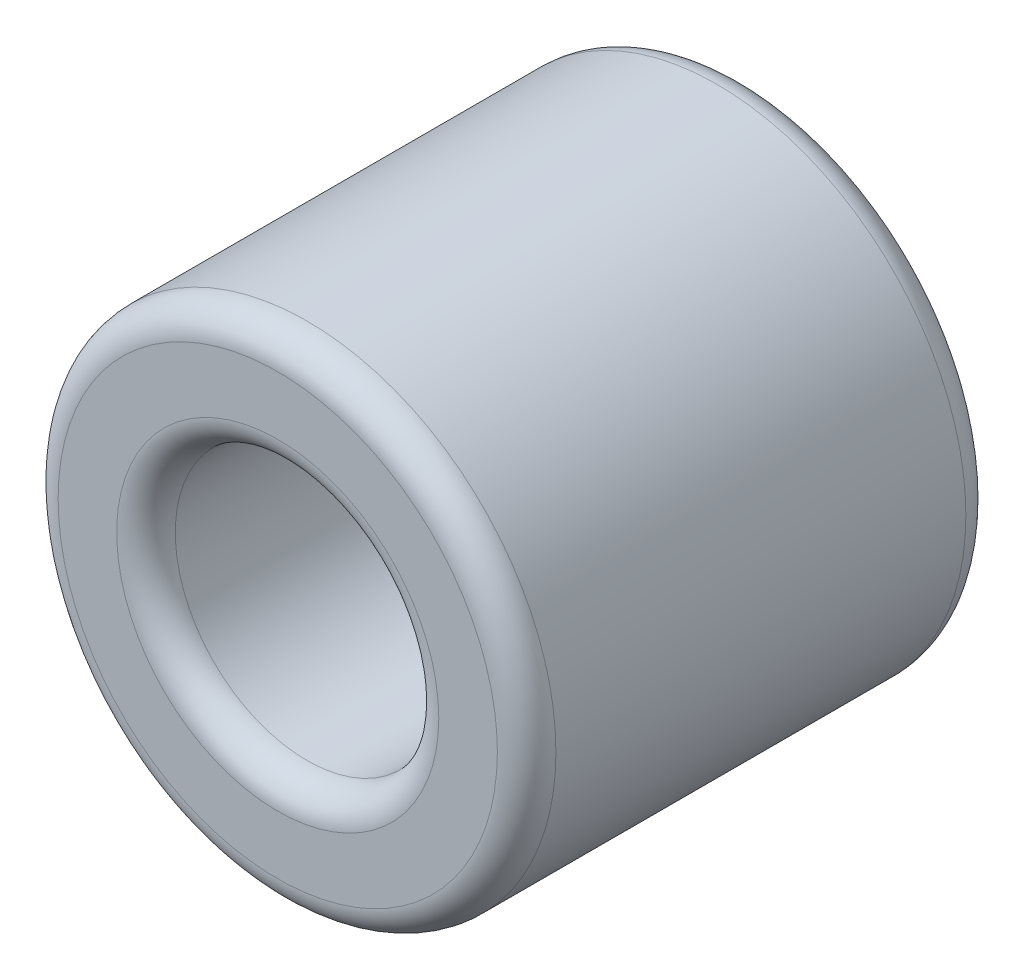
ISO-10303-21;
HEADER;
FILE_DESCRIPTION(('STEP AP214'),'2;1');
FILE_NAME('part.step','',(''),(''),'','','');
FILE_SCHEMA(('AUTOMOTIVE_DESIGN { 1 0 10303 214 1 1 1 1 }'));
ENDSEC;
DATA;
#1=APPLICATION_CONTEXT('core data for automotive mechanical design processes');
#2=APPLICATION_PROTOCOL_DEFINITION('international standard','automotive_design',2000,#1);
#3=PRODUCT_CONTEXT('',#1,'mechanical');
#4=PRODUCT('Part','Part','',(#3));
#5=PRODUCT_RELATED_PRODUCT_CATEGORY('part','',(#4));
#6=PRODUCT_DEFINITION_FORMATION('','',#4);
#7=PRODUCT_DEFINITION_CONTEXT('part definition',#1,'design');
#8=PRODUCT_DEFINITION('design','',#6,#7);
#9=PRODUCT_DEFINITION_SHAPE('','',#8);
#10=(LENGTH_UNIT() NAMED_UNIT(*) SI_UNIT(.MILLI.,.METRE.));
#11=(NAMED_UNIT(*) PLANE_ANGLE_UNIT() SI_UNIT($,.RADIAN.));
#12=(NAMED_UNIT(*) SI_UNIT($,.STERADIAN.) SOLID_ANGLE_UNIT());
#13=UNCERTAINTY_MEASURE_WITH_UNIT(LENGTH_MEASURE(1.E-05),#10,'distance_accuracy_value','');
#14=(GEOMETRIC_REPRESENTATION_CONTEXT(3) GLOBAL_UNCERTAINTY_ASSIGNED_CONTEXT((#13)) GLOBAL_UNIT_ASSIGNED_CONTEXT((#10,
#11,#12)) REPRESENTATION_CONTEXT('',''));
#15=CARTESIAN_POINT('',(0.,0.,0.));
#16=DIRECTION('',(0.,0.,1.));
#17=DIRECTION('',(1.,0.,0.));
#18=AXIS2_PLACEMENT_3D('',#15,#16,#17);
#19=CARTESIAN_POINT('',(0.,0.,8.));
#20=DIRECTION('',(0.,0.,1.));
#21=DIRECTION('',(1.,0.,0.));
#22=AXIS2_PLACEMENT_3D('',#19,#20,#21);
#23=PLANE('',#22);
#24=CARTESIAN_POINT('',(0.,0.,8.));
#25=DIRECTION('',(0.,0.,1.));
#26=DIRECTION('',(1.,0.,0.));
#27=AXIS2_PLACEMENT_3D('',#24,#25,#26);
#28=CIRCLE('',#27,2.75);
#29=CARTESIAN_POINT('',(2.75,0.,8.));
#30=VERTEX_POINT('',#29);
#31=EDGE_CURVE('E10',#30,#30,#28,.F.);
#32=ORIENTED_EDGE('',*,*,#31,.T.);
#33=EDGE_LOOP('',(#32));
#34=FACE_BOUND('',#33,.T.);
#35=CARTESIAN_POINT('',(0.,0.,8.));
#36=DIRECTION('',(0.,0.,1.));
#37=DIRECTION('',(1.,0.,0.));
#38=AXIS2_PLACEMENT_3D('',#35,#36,#37);
#39=CIRCLE('',#38,3.75);
#40=CARTESIAN_POINT('',(3.75,0.,8.));
#41=VERTEX_POINT('',#40);
#42=EDGE_CURVE('E42',#41,#41,#39,.T.);
#43=ORIENTED_EDGE('',*,*,#42,.T.);
#44=EDGE_LOOP('',(#43));
#45=FACE_BOUND('',#44,.T.);
#46=ADVANCED_FACE('F40',(#34,#45),#23,.T.);
#47=CARTESIAN_POINT('',(0.,0.,0.));
#48=DIRECTION('',(0.,0.,1.));
#49=DIRECTION('',(1.,0.,0.));
#50=AXIS2_PLACEMENT_3D('',#47,#48,#49);
#51=PLANE('',#50);
#52=CARTESIAN_POINT('',(0.,0.,0.));
#53=DIRECTION('',(0.,0.,1.));
#54=DIRECTION('',(1.,0.,0.));
#55=AXIS2_PLACEMENT_3D('',#52,#53,#54);
#56=CIRCLE('',#55,2.75);
#57=CARTESIAN_POINT('',(2.75,0.,0.));
#58=VERTEX_POINT('',#57);
#59=EDGE_CURVE('E64',#58,#58,#56,.T.);
#60=ORIENTED_EDGE('',*,*,#59,.T.);
#61=EDGE_LOOP('',(#60));
#62=FACE_BOUND('',#61,.T.);
#63=CARTESIAN_POINT('',(0.,0.,0.));
#64=DIRECTION('',(0.,0.,1.));
#65=DIRECTION('',(1.,0.,0.));
#66=AXIS2_PLACEMENT_3D('',#63,#64,#65);
#67=CIRCLE('',#66,3.75);
#68=CARTESIAN_POINT('',(3.75,0.,0.));
#69=VERTEX_POINT('',#68);
#70=EDGE_CURVE('E67',#69,#69,#67,.F.);
#71=ORIENTED_EDGE('',*,*,#70,.T.);
#72=EDGE_LOOP('',(#71));
#73=FACE_BOUND('',#72,.T.);
#74=ADVANCED_FACE('F68',(#62,#73),#51,.F.);
#75=CARTESIAN_POINT('',(0.,0.,8.));
#76=DIRECTION('',(0.,0.,-1.));
#77=DIRECTION('',(-1.,0.,0.));
#78=AXIS2_PLACEMENT_3D('',#75,#76,#77);
#79=CYLINDRICAL_SURFACE('',#78,4.25);
#80=CARTESIAN_POINT('',(0.,0.,0.5));
#81=DIRECTION('',(0.,0.,1.));
#82=DIRECTION('',(1.,0.,0.));
#83=AXIS2_PLACEMENT_3D('',#80,#81,#82);
#84=CIRCLE('',#83,4.25);
#85=CARTESIAN_POINT('',(4.25,0.,0.5));
#86=VERTEX_POINT('',#85);
#87=EDGE_CURVE('E48',#86,#86,#84,.T.);
#88=ORIENTED_EDGE('',*,*,#87,.T.);
#89=EDGE_LOOP('',(#88));
#90=FACE_BOUND('',#89,.T.);
#91=CARTESIAN_POINT('',(0.,0.,7.5));
#92=DIRECTION('',(0.,0.,1.));
#93=DIRECTION('',(1.,0.,0.));
#94=AXIS2_PLACEMENT_3D('',#91,#92,#93);
#95=CIRCLE('',#94,4.25);
#96=CARTESIAN_POINT('',(4.25,0.,7.5));
#97=VERTEX_POINT('',#96);
#98=EDGE_CURVE('E55',#97,#97,#95,.F.);
#99=ORIENTED_EDGE('',*,*,#98,.T.);
#100=EDGE_LOOP('',(#99));
#101=FACE_BOUND('',#100,.T.);
#102=ADVANCED_FACE('F78',(#90,#101),#79,.T.);
#103=CARTESIAN_POINT('',(0.,0.,8.));
#104=DIRECTION('',(0.,0.,-1.));
#105=DIRECTION('',(-1.,0.,0.));
#106=AXIS2_PLACEMENT_3D('',#103,#104,#105);
#107=CYLINDRICAL_SURFACE('',#106,2.25);
#108=CARTESIAN_POINT('',(0.,0.,0.5));
#109=DIRECTION('',(0.,0.,1.));
#110=DIRECTION('',(1.,0.,0.));
#111=AXIS2_PLACEMENT_3D('',#108,#109,#110);
#112=CIRCLE('',#111,2.25);
#113=CARTESIAN_POINT('',(2.25,0.,0.5));
#114=VERTEX_POINT('',#113);
#115=EDGE_CURVE('E60',#114,#114,#112,.F.);
#116=ORIENTED_EDGE('',*,*,#115,.T.);
#117=EDGE_LOOP('',(#116));
#118=FACE_BOUND('',#117,.T.);
#119=CARTESIAN_POINT('',(0.,0.,7.5));
#120=DIRECTION('',(0.,0.,1.));
#121=DIRECTION('',(1.,0.,0.));
#122=AXIS2_PLACEMENT_3D('',#119,#120,#121);
#123=CIRCLE('',#122,2.25);
#124=CARTESIAN_POINT('',(2.25,0.,7.5));
#125=VERTEX_POINT('',#124);
#126=EDGE_CURVE('E58',#125,#125,#123,.T.);
#127=ORIENTED_EDGE('',*,*,#126,.T.);
#128=EDGE_LOOP('',(#127));
#129=FACE_BOUND('',#128,.T.);
#130=ADVANCED_FACE('F85',(#118,#129),#107,.F.);
#131=CARTESIAN_POINT('',(0.,0.,0.5));
#132=DIRECTION('',(0.,0.,1.));
#133=DIRECTION('',(1.,0.,0.));
#134=AXIS2_PLACEMENT_3D('',#131,#132,#133);
#135=TOROIDAL_SURFACE('',#134,2.75,0.5);
#136=ORIENTED_EDGE('',*,*,#115,.F.);
#137=EDGE_LOOP('',(#136));
#138=FACE_BOUND('',#137,.T.);
#139=ORIENTED_EDGE('',*,*,#59,.F.);
#140=EDGE_LOOP('',(#139));
#141=FACE_BOUND('',#140,.T.);
#142=ADVANCED_FACE('F77',(#138,#141),#135,.T.);
#143=CARTESIAN_POINT('',(0.,0.,0.5));
#144=DIRECTION('',(0.,0.,1.));
#145=DIRECTION('',(1.,0.,0.));
#146=AXIS2_PLACEMENT_3D('',#143,#144,#145);
#147=TOROIDAL_SURFACE('',#146,3.75,0.5);
#148=ORIENTED_EDGE('',*,*,#70,.F.);
#149=EDGE_LOOP('',(#148));
#150=FACE_BOUND('',#149,.T.);
#151=ORIENTED_EDGE('',*,*,#87,.F.);
#152=EDGE_LOOP('',(#151));
#153=FACE_BOUND('',#152,.T.);
#154=ADVANCED_FACE('F75',(#150,#153),#147,.T.);
#155=CARTESIAN_POINT('',(0.,0.,7.5));
#156=DIRECTION('',(0.,0.,1.));
#157=DIRECTION('',(1.,0.,0.));
#158=AXIS2_PLACEMENT_3D('',#155,#156,#157);
#159=TOROIDAL_SURFACE('',#158,2.75,0.5);
#160=ORIENTED_EDGE('',*,*,#31,.F.);
#161=EDGE_LOOP('',(#160));
#162=FACE_BOUND('',#161,.T.);
#163=ORIENTED_EDGE('',*,*,#126,.F.);
#164=EDGE_LOOP('',(#163));
#165=FACE_BOUND('',#164,.T.);
#166=ADVANCED_FACE('F73',(#162,#165),#159,.T.);
#167=CARTESIAN_POINT('',(0.,0.,7.5));
#168=DIRECTION('',(0.,0.,1.));
#169=DIRECTION('',(1.,0.,0.));
#170=AXIS2_PLACEMENT_3D('',#167,#168,#169);
#171=TOROIDAL_SURFACE('',#170,3.75,0.5);
#172=ORIENTED_EDGE('',*,*,#98,.F.);
#173=EDGE_LOOP('',(#172));
#174=FACE_BOUND('',#173,.T.);
#175=ORIENTED_EDGE('',*,*,#42,.F.);
#176=EDGE_LOOP('',(#175));
#177=FACE_BOUND('',#176,.T.);
#178=ADVANCED_FACE('F39',(#174,#177),#171,.T.);
#179=CLOSED_SHELL('',(#46,#74,#102,#130,#142,#154,#166,#178));
#180=MANIFOLD_SOLID_BREP('B2',#179);
#181=ADVANCED_BREP_SHAPE_REPRESENTATION('',(#18,#180),#14);
#182=SHAPE_DEFINITION_REPRESENTATION(#9,#181);
ENDSEC;
END-ISO-10303-21;
